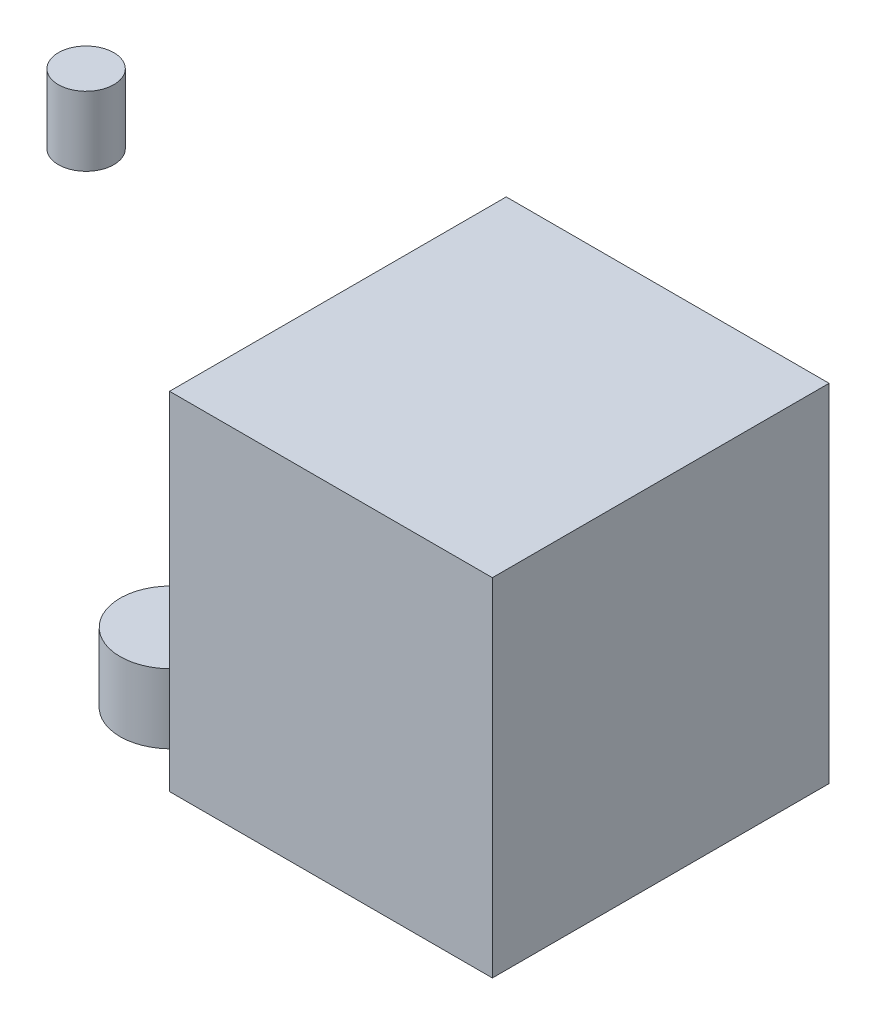
ISO-10303-21;
HEADER;
FILE_DESCRIPTION(('STEP AP214'),'2;1');
FILE_NAME('part.step','',(''),(''),'','','');
FILE_SCHEMA(('AUTOMOTIVE_DESIGN { 1 0 10303 214 1 1 1 1 }'));
ENDSEC;
DATA;
#1=APPLICATION_CONTEXT('core data for automotive mechanical design processes');
#2=APPLICATION_PROTOCOL_DEFINITION('international standard','automotive_design',2000,#1);
#3=PRODUCT_CONTEXT('',#1,'mechanical');
#4=PRODUCT('Part','Part','',(#3));
#5=PRODUCT_RELATED_PRODUCT_CATEGORY('part','',(#4));
#6=PRODUCT_DEFINITION_FORMATION('','',#4);
#7=PRODUCT_DEFINITION_CONTEXT('part definition',#1,'design');
#8=PRODUCT_DEFINITION('design','',#6,#7);
#9=PRODUCT_DEFINITION_SHAPE('','',#8);
#10=(LENGTH_UNIT() NAMED_UNIT(*) SI_UNIT(.MILLI.,.METRE.));
#11=(NAMED_UNIT(*) PLANE_ANGLE_UNIT() SI_UNIT($,.RADIAN.));
#12=(NAMED_UNIT(*) SI_UNIT($,.STERADIAN.) SOLID_ANGLE_UNIT());
#13=UNCERTAINTY_MEASURE_WITH_UNIT(LENGTH_MEASURE(1.E-05),#10,'distance_accuracy_value','');
#14=(GEOMETRIC_REPRESENTATION_CONTEXT(3) GLOBAL_UNCERTAINTY_ASSIGNED_CONTEXT((#13)) GLOBAL_UNIT_ASSIGNED_CONTEXT((#10,
#11,#12)) REPRESENTATION_CONTEXT('',''));
#15=CARTESIAN_POINT('',(0.,0.,0.));
#16=DIRECTION('',(0.,0.,1.));
#17=DIRECTION('',(1.,0.,0.));
#18=AXIS2_PLACEMENT_3D('',#15,#16,#17);
#19=CARTESIAN_POINT('',(-59.5908745469034,60.,0.));
#20=DIRECTION('',(0.,-1.,0.));
#21=DIRECTION('',(0.,0.,-1.));
#22=AXIS2_PLACEMENT_3D('',#19,#20,#21);
#23=CYLINDRICAL_SURFACE('',#22,4.);
#24=CARTESIAN_POINT('',(-59.5908745469034,60.,0.));
#25=DIRECTION('',(0.,1.,0.));
#26=DIRECTION('',(0.,0.,1.));
#27=AXIS2_PLACEMENT_3D('',#24,#25,#26);
#28=CIRCLE('',#27,4.);
#29=CARTESIAN_POINT('',(-59.5908745469034,60.,4.));
#30=VERTEX_POINT('',#29);
#31=EDGE_CURVE('E11',#30,#30,#28,.T.);
#32=ORIENTED_EDGE('',*,*,#31,.F.);
#33=EDGE_LOOP('',(#32));
#34=FACE_BOUND('',#33,.T.);
#35=CARTESIAN_POINT('',(-59.5908745469034,50.,0.));
#36=DIRECTION('',(0.,1.,0.));
#37=DIRECTION('',(0.,0.,1.));
#38=AXIS2_PLACEMENT_3D('',#35,#36,#37);
#39=CIRCLE('',#38,4.);
#40=CARTESIAN_POINT('',(-59.5908745469034,50.,4.));
#41=VERTEX_POINT('',#40);
#42=EDGE_CURVE('E47',#41,#41,#39,.T.);
#43=ORIENTED_EDGE('',*,*,#42,.T.);
#44=EDGE_LOOP('',(#43));
#45=FACE_BOUND('',#44,.T.);
#46=ADVANCED_FACE('F44',(#34,#45),#23,.T.);
#47=CARTESIAN_POINT('',(-59.5908745469034,60.,0.));
#48=DIRECTION('',(0.,1.,0.));
#49=DIRECTION('',(0.,0.,1.));
#50=AXIS2_PLACEMENT_3D('',#47,#48,#49);
#51=PLANE('',#50);
#52=ORIENTED_EDGE('',*,*,#31,.T.);
#53=EDGE_LOOP('',(#52));
#54=FACE_BOUND('',#53,.T.);
#55=ADVANCED_FACE('F59',(#54),#51,.T.);
#56=CARTESIAN_POINT('',(-59.5908745469034,50.,0.));
#57=DIRECTION('',(0.,1.,0.));
#58=DIRECTION('',(0.,0.,1.));
#59=AXIS2_PLACEMENT_3D('',#56,#57,#58);
#60=PLANE('',#59);
#61=ORIENTED_EDGE('',*,*,#42,.F.);
#62=EDGE_LOOP('',(#61));
#63=FACE_BOUND('',#62,.T.);
#64=ADVANCED_FACE('F57',(#63),#60,.F.);
#65=CLOSED_SHELL('',(#46,#55,#64));
#66=MANIFOLD_SOLID_BREP('B2',#65);
#67=CARTESIAN_POINT('',(-33.6995546425519,10.,13.6737280246071));
#68=DIRECTION('',(0.,-1.,0.));
#69=DIRECTION('',(0.,0.,-1.));
#70=AXIS2_PLACEMENT_3D('',#67,#68,#69);
#71=CYLINDRICAL_SURFACE('',#70,7.30884690212847);
#72=CARTESIAN_POINT('',(-33.6995546425519,10.,13.6737280246071));
#73=DIRECTION('',(0.,1.,0.));
#74=DIRECTION('',(0.,0.,1.));
#75=AXIS2_PLACEMENT_3D('',#72,#73,#74);
#76=CIRCLE('',#75,7.30884690212847);
#77=CARTESIAN_POINT('',(-33.6995546425519,10.,20.9825749267355));
#78=VERTEX_POINT('',#77);
#79=EDGE_CURVE('E43',#78,#78,#76,.T.);
#80=ORIENTED_EDGE('',*,*,#79,.F.);
#81=EDGE_LOOP('',(#80));
#82=FACE_BOUND('',#81,.T.);
#83=CARTESIAN_POINT('',(-33.6995546425519,0.,13.6737280246071));
#84=DIRECTION('',(0.,1.,0.));
#85=DIRECTION('',(0.,0.,1.));
#86=AXIS2_PLACEMENT_3D('',#83,#84,#85);
#87=CIRCLE('',#86,7.30884690212847);
#88=CARTESIAN_POINT('',(-33.6995546425519,0.,20.9825749267355));
#89=VERTEX_POINT('',#88);
#90=EDGE_CURVE('E97',#89,#89,#87,.T.);
#91=ORIENTED_EDGE('',*,*,#90,.T.);
#92=EDGE_LOOP('',(#91));
#93=FACE_BOUND('',#92,.T.);
#94=ADVANCED_FACE('F94',(#82,#93),#71,.T.);
#95=CARTESIAN_POINT('',(-33.6995546425519,10.,13.6737280246071));
#96=DIRECTION('',(0.,1.,0.));
#97=DIRECTION('',(0.,0.,1.));
#98=AXIS2_PLACEMENT_3D('',#95,#96,#97);
#99=PLANE('',#98);
#100=ORIENTED_EDGE('',*,*,#79,.T.);
#101=EDGE_LOOP('',(#100));
#102=FACE_BOUND('',#101,.T.);
#103=ADVANCED_FACE('F109',(#102),#99,.T.);
#104=CARTESIAN_POINT('',(-33.6995546425519,0.,13.6737280246071));
#105=DIRECTION('',(0.,1.,0.));
#106=DIRECTION('',(0.,0.,1.));
#107=AXIS2_PLACEMENT_3D('',#104,#105,#106);
#108=PLANE('',#107);
#109=ORIENTED_EDGE('',*,*,#90,.F.);
#110=EDGE_LOOP('',(#109));
#111=FACE_BOUND('',#110,.T.);
#112=ADVANCED_FACE('F107',(#111),#108,.F.);
#113=CLOSED_SHELL('',(#94,#103,#112));
#114=MANIFOLD_SOLID_BREP('B6',#113);
#115=CARTESIAN_POINT('',(23.2789388696655,50.,24.2781088312976));
#116=DIRECTION('',(-1.,0.,0.));
#117=DIRECTION('',(0.,0.,1.));
#118=AXIS2_PLACEMENT_3D('',#115,#116,#117);
#119=PLANE('',#118);
#120=DIRECTION('',(0.,0.,-1.));
#121=VECTOR('',#120,1.);
#122=CARTESIAN_POINT('',(23.2789388696655,0.,24.2781088312976));
#123=LINE('',#122,#121);
#124=CARTESIAN_POINT('',(23.2789388696655,0.,24.2781088312976));
#125=VERTEX_POINT('',#124);
#126=CARTESIAN_POINT('',(23.2789388696655,0.,-24.2781088312976));
#127=VERTEX_POINT('',#126);
#128=EDGE_CURVE('E198',#125,#127,#123,.T.);
#129=ORIENTED_EDGE('',*,*,#128,.T.);
#130=DIRECTION('',(0.,-1.,0.));
#131=VECTOR('',#130,1.);
#132=CARTESIAN_POINT('',(23.2789388696655,50.,-24.2781088312976));
#133=LINE('',#132,#131);
#134=CARTESIAN_POINT('',(23.2789388696655,50.,-24.2781088312976));
#135=VERTEX_POINT('',#134);
#136=EDGE_CURVE('E92',#135,#127,#133,.T.);
#137=ORIENTED_EDGE('',*,*,#136,.F.);
#138=DIRECTION('',(0.,0.,-1.));
#139=VECTOR('',#138,1.);
#140=CARTESIAN_POINT('',(23.2789388696655,50.,24.2781088312976));
#141=LINE('',#140,#139);
#142=CARTESIAN_POINT('',(23.2789388696655,50.,24.2781088312976));
#143=VERTEX_POINT('',#142);
#144=EDGE_CURVE('E186',#143,#135,#141,.T.);
#145=ORIENTED_EDGE('',*,*,#144,.F.);
#146=DIRECTION('',(0.,-1.,0.));
#147=VECTOR('',#146,1.);
#148=CARTESIAN_POINT('',(23.2789388696655,50.,24.2781088312976));
#149=LINE('',#148,#147);
#150=EDGE_CURVE('E194',#143,#125,#149,.T.);
#151=ORIENTED_EDGE('',*,*,#150,.T.);
#152=EDGE_LOOP('',(#129,#137,#145,#151));
#153=FACE_BOUND('',#152,.T.);
#154=ADVANCED_FACE('F135',(#153),#119,.F.);
#155=CARTESIAN_POINT('',(-23.2789388696655,50.,-24.2781088312976));
#156=DIRECTION('',(0.,0.,1.));
#157=DIRECTION('',(1.,0.,0.));
#158=AXIS2_PLACEMENT_3D('',#155,#156,#157);
#159=PLANE('',#158);
#160=DIRECTION('',(-1.,0.,0.));
#161=VECTOR('',#160,1.);
#162=CARTESIAN_POINT('',(-23.2789388696655,0.,-24.2781088312976));
#163=LINE('',#162,#161);
#164=CARTESIAN_POINT('',(-23.2789388696655,0.,-24.2781088312976));
#165=VERTEX_POINT('',#164);
#166=EDGE_CURVE('E190',#127,#165,#163,.T.);
#167=ORIENTED_EDGE('',*,*,#166,.T.);
#168=DIRECTION('',(0.,-1.,0.));
#169=VECTOR('',#168,1.);
#170=CARTESIAN_POINT('',(-23.2789388696655,50.,-24.2781088312976));
#171=LINE('',#170,#169);
#172=CARTESIAN_POINT('',(-23.2789388696655,50.,-24.2781088312976));
#173=VERTEX_POINT('',#172);
#174=EDGE_CURVE('E143',#173,#165,#171,.T.);
#175=ORIENTED_EDGE('',*,*,#174,.F.);
#176=DIRECTION('',(-1.,0.,0.));
#177=VECTOR('',#176,1.);
#178=CARTESIAN_POINT('',(-23.2789388696655,50.,-24.2781088312976));
#179=LINE('',#178,#177);
#180=EDGE_CURVE('E181',#135,#173,#179,.T.);
#181=ORIENTED_EDGE('',*,*,#180,.F.);
#182=ORIENTED_EDGE('',*,*,#136,.T.);
#183=EDGE_LOOP('',(#167,#175,#181,#182));
#184=FACE_BOUND('',#183,.T.);
#185=ADVANCED_FACE('F189',(#184),#159,.F.);
#186=CARTESIAN_POINT('',(-23.2789388696655,50.,24.2781088312976));
#187=DIRECTION('',(1.,0.,0.));
#188=DIRECTION('',(0.,0.,-1.));
#189=AXIS2_PLACEMENT_3D('',#186,#187,#188);
#190=PLANE('',#189);
#191=DIRECTION('',(0.,0.,1.));
#192=VECTOR('',#191,1.);
#193=CARTESIAN_POINT('',(-23.2789388696655,0.,24.2781088312976));
#194=LINE('',#193,#192);
#195=CARTESIAN_POINT('',(-23.2789388696655,0.,24.2781088312976));
#196=VERTEX_POINT('',#195);
#197=EDGE_CURVE('E168',#165,#196,#194,.T.);
#198=ORIENTED_EDGE('',*,*,#197,.T.);
#199=DIRECTION('',(0.,-1.,0.));
#200=VECTOR('',#199,1.);
#201=CARTESIAN_POINT('',(-23.2789388696655,50.,24.2781088312976));
#202=LINE('',#201,#200);
#203=CARTESIAN_POINT('',(-23.2789388696655,50.,24.2781088312976));
#204=VERTEX_POINT('',#203);
#205=EDGE_CURVE('E191',#204,#196,#202,.T.);
#206=ORIENTED_EDGE('',*,*,#205,.F.);
#207=DIRECTION('',(0.,0.,1.));
#208=VECTOR('',#207,1.);
#209=CARTESIAN_POINT('',(-23.2789388696655,50.,24.2781088312976));
#210=LINE('',#209,#208);
#211=EDGE_CURVE('E184',#173,#204,#210,.T.);
#212=ORIENTED_EDGE('',*,*,#211,.F.);
#213=ORIENTED_EDGE('',*,*,#174,.T.);
#214=EDGE_LOOP('',(#198,#206,#212,#213));
#215=FACE_BOUND('',#214,.T.);
#216=ADVANCED_FACE('F192',(#215),#190,.F.);
#217=CARTESIAN_POINT('',(-23.2789388696655,50.,24.2781088312976));
#218=DIRECTION('',(0.,0.,-1.));
#219=DIRECTION('',(-1.,0.,0.));
#220=AXIS2_PLACEMENT_3D('',#217,#218,#219);
#221=PLANE('',#220);
#222=DIRECTION('',(1.,0.,0.));
#223=VECTOR('',#222,1.);
#224=CARTESIAN_POINT('',(-23.2789388696655,0.,24.2781088312976));
#225=LINE('',#224,#223);
#226=EDGE_CURVE('E174',#196,#125,#225,.T.);
#227=ORIENTED_EDGE('',*,*,#226,.T.);
#228=ORIENTED_EDGE('',*,*,#150,.F.);
#229=DIRECTION('',(1.,0.,0.));
#230=VECTOR('',#229,1.);
#231=CARTESIAN_POINT('',(-23.2789388696655,50.,24.2781088312976));
#232=LINE('',#231,#230);
#233=EDGE_CURVE('E151',#204,#143,#232,.T.);
#234=ORIENTED_EDGE('',*,*,#233,.F.);
#235=ORIENTED_EDGE('',*,*,#205,.T.);
#236=EDGE_LOOP('',(#227,#228,#234,#235));
#237=FACE_BOUND('',#236,.T.);
#238=ADVANCED_FACE('F205',(#237),#221,.F.);
#239=CARTESIAN_POINT('',(0.,50.,0.));
#240=DIRECTION('',(0.,-1.,0.));
#241=DIRECTION('',(0.,0.,-1.));
#242=AXIS2_PLACEMENT_3D('',#239,#240,#241);
#243=PLANE('',#242);
#244=ORIENTED_EDGE('',*,*,#144,.T.);
#245=ORIENTED_EDGE('',*,*,#180,.T.);
#246=ORIENTED_EDGE('',*,*,#211,.T.);
#247=ORIENTED_EDGE('',*,*,#233,.T.);
#248=EDGE_LOOP('',(#244,#245,#246,#247));
#249=FACE_BOUND('',#248,.T.);
#250=ADVANCED_FACE('F182',(#249),#243,.F.);
#251=CARTESIAN_POINT('',(0.,0.,0.));
#252=DIRECTION('',(0.,-1.,0.));
#253=DIRECTION('',(0.,0.,-1.));
#254=AXIS2_PLACEMENT_3D('',#251,#252,#253);
#255=PLANE('',#254);
#256=ORIENTED_EDGE('',*,*,#128,.F.);
#257=ORIENTED_EDGE('',*,*,#226,.F.);
#258=ORIENTED_EDGE('',*,*,#197,.F.);
#259=ORIENTED_EDGE('',*,*,#166,.F.);
#260=EDGE_LOOP('',(#256,#257,#258,#259));
#261=FACE_BOUND('',#260,.T.);
#262=ADVANCED_FACE('F208',(#261),#255,.T.);
#263=CLOSED_SHELL('',(#154,#185,#216,#238,#250,#262));
#264=MANIFOLD_SOLID_BREP('B38',#263);
#265=ADVANCED_BREP_SHAPE_REPRESENTATION('',(#18,#66,#114,#264),#14);
#266=SHAPE_DEFINITION_REPRESENTATION(#9,#265);
ENDSEC;
END-ISO-10303-21;
